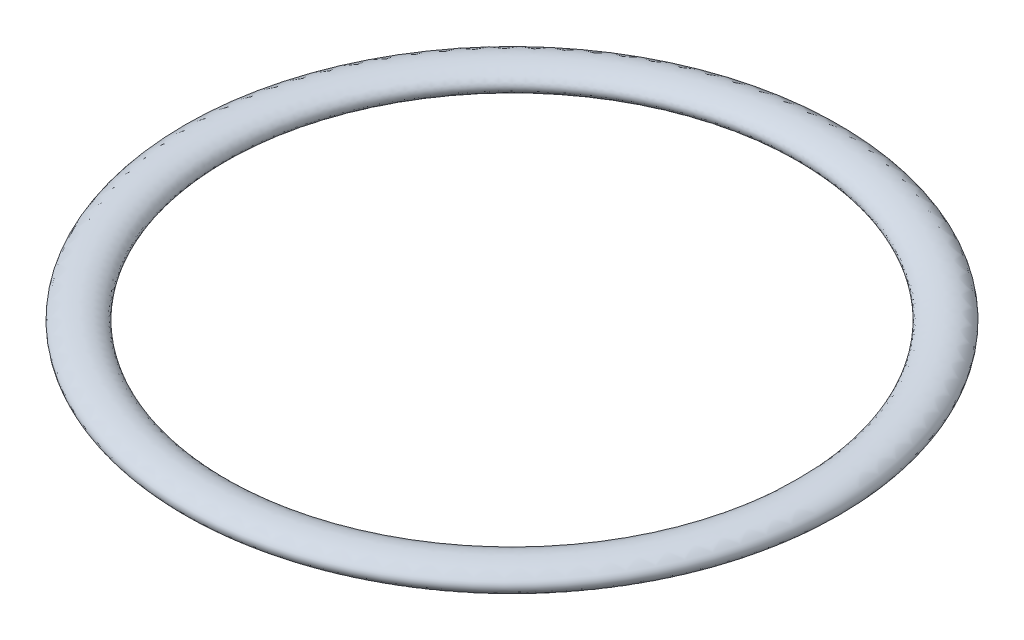
ISO-10303-21;
HEADER;
FILE_DESCRIPTION(('STEP AP214'),'2;1');
FILE_NAME('part.step','',(''),(''),'','','');
FILE_SCHEMA(('AUTOMOTIVE_DESIGN { 1 0 10303 214 1 1 1 1 }'));
ENDSEC;
DATA;
#1=APPLICATION_CONTEXT('core data for automotive mechanical design processes');
#2=APPLICATION_PROTOCOL_DEFINITION('international standard','automotive_design',2000,#1);
#3=PRODUCT_CONTEXT('',#1,'mechanical');
#4=PRODUCT('Part','Part','',(#3));
#5=PRODUCT_RELATED_PRODUCT_CATEGORY('part','',(#4));
#6=PRODUCT_DEFINITION_FORMATION('','',#4);
#7=PRODUCT_DEFINITION_CONTEXT('part definition',#1,'design');
#8=PRODUCT_DEFINITION('design','',#6,#7);
#9=PRODUCT_DEFINITION_SHAPE('','',#8);
#10=(LENGTH_UNIT() NAMED_UNIT(*) SI_UNIT(.MILLI.,.METRE.));
#11=(NAMED_UNIT(*) PLANE_ANGLE_UNIT() SI_UNIT($,.RADIAN.));
#12=(NAMED_UNIT(*) SI_UNIT($,.STERADIAN.) SOLID_ANGLE_UNIT());
#13=UNCERTAINTY_MEASURE_WITH_UNIT(LENGTH_MEASURE(1.E-05),#10,'distance_accuracy_value','');
#14=(GEOMETRIC_REPRESENTATION_CONTEXT(3) GLOBAL_UNCERTAINTY_ASSIGNED_CONTEXT((#13)) GLOBAL_UNIT_ASSIGNED_CONTEXT((#10,
#11,#12)) REPRESENTATION_CONTEXT('',''));
#15=CARTESIAN_POINT('',(0.,0.,0.));
#16=DIRECTION('',(0.,0.,1.));
#17=DIRECTION('',(1.,0.,0.));
#18=AXIS2_PLACEMENT_3D('',#15,#16,#17);
#19=CARTESIAN_POINT('',(18.425,0.,0.));
#20=DIRECTION('',(0.,0.,1.));
#21=DIRECTION('',(1.,0.,0.));
#22=AXIS2_PLACEMENT_3D('',#19,#20,#21);
#23=ELLIPSE('',#22,1.38492490525429,0.725);
#24=CARTESIAN_POINT('',(0.,-500.,0.));
#25=DIRECTION('',(0.,-1.,0.));
#26=AXIS1_PLACEMENT('',#24,#25);
#27=SURFACE_OF_REVOLUTION('',#23,#26);
#28=ADVANCED_FACE('F34',(),#27,.F.);
#29=CLOSED_SHELL('',(#28));
#30=MANIFOLD_SOLID_BREP('B2',#29);
#31=ADVANCED_BREP_SHAPE_REPRESENTATION('',(#18,#30),#14);
#32=SHAPE_DEFINITION_REPRESENTATION(#9,#31);
ENDSEC;
END-ISO-10303-21;
